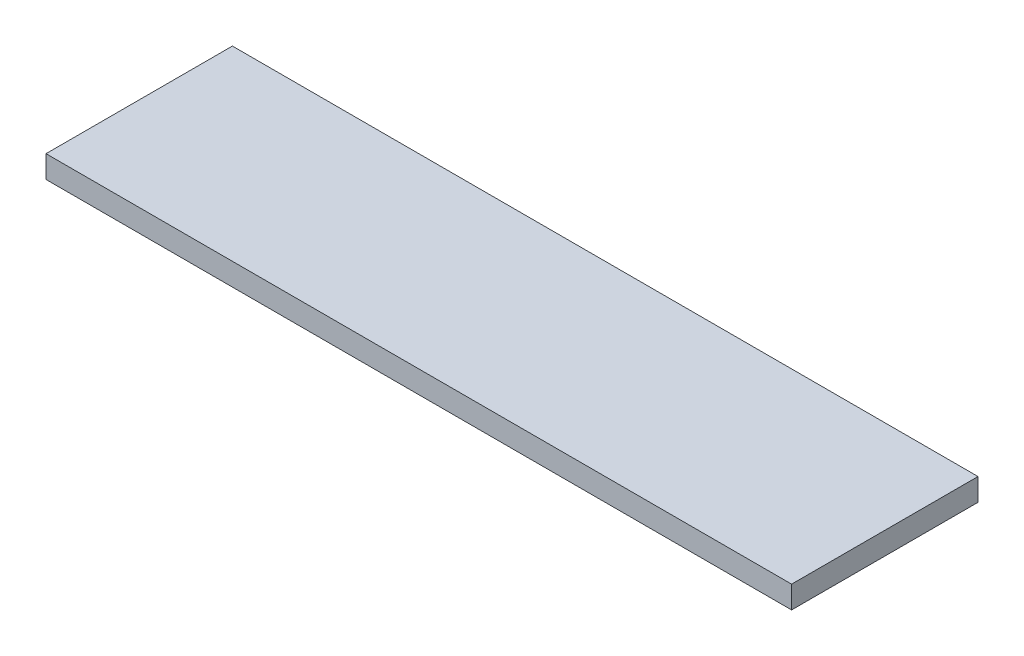
ISO-10303-21;
HEADER;
FILE_DESCRIPTION(('STEP AP214'),'2;1');
FILE_NAME('part.step','',(''),(''),'','','');
FILE_SCHEMA(('AUTOMOTIVE_DESIGN { 1 0 10303 214 1 1 1 1 }'));
ENDSEC;
DATA;
#1=APPLICATION_CONTEXT('core data for automotive mechanical design processes');
#2=APPLICATION_PROTOCOL_DEFINITION('international standard','automotive_design',2000,#1);
#3=PRODUCT_CONTEXT('',#1,'mechanical');
#4=PRODUCT('Part','Part','',(#3));
#5=PRODUCT_RELATED_PRODUCT_CATEGORY('part','',(#4));
#6=PRODUCT_DEFINITION_FORMATION('','',#4);
#7=PRODUCT_DEFINITION_CONTEXT('part definition',#1,'design');
#8=PRODUCT_DEFINITION('design','',#6,#7);
#9=PRODUCT_DEFINITION_SHAPE('','',#8);
#10=(LENGTH_UNIT() NAMED_UNIT(*) SI_UNIT(.MILLI.,.METRE.));
#11=(NAMED_UNIT(*) PLANE_ANGLE_UNIT() SI_UNIT($,.RADIAN.));
#12=(NAMED_UNIT(*) SI_UNIT($,.STERADIAN.) SOLID_ANGLE_UNIT());
#13=UNCERTAINTY_MEASURE_WITH_UNIT(LENGTH_MEASURE(1.E-05),#10,'distance_accuracy_value','');
#14=(GEOMETRIC_REPRESENTATION_CONTEXT(3) GLOBAL_UNCERTAINTY_ASSIGNED_CONTEXT((#13)) GLOBAL_UNIT_ASSIGNED_CONTEXT((#10,
#11,#12)) REPRESENTATION_CONTEXT('',''));
#15=CARTESIAN_POINT('',(0.,0.,0.));
#16=DIRECTION('',(0.,0.,1.));
#17=DIRECTION('',(1.,0.,0.));
#18=AXIS2_PLACEMENT_3D('',#15,#16,#17);
#19=CARTESIAN_POINT('',(-100.,3.,25.));
#20=DIRECTION('',(1.,0.,0.));
#21=DIRECTION('',(0.,0.,-1.));
#22=AXIS2_PLACEMENT_3D('',#19,#20,#21);
#23=PLANE('',#22);
#24=DIRECTION('',(0.,0.,1.));
#25=VECTOR('',#24,1.);
#26=CARTESIAN_POINT('',(-100.,-3.,25.));
#27=LINE('',#26,#25);
#28=CARTESIAN_POINT('',(-100.,-3.,-25.));
#29=VERTEX_POINT('',#28);
#30=CARTESIAN_POINT('',(-100.,-3.,25.));
#31=VERTEX_POINT('',#30);
#32=EDGE_CURVE('E102',#29,#31,#27,.T.);
#33=ORIENTED_EDGE('',*,*,#32,.T.);
#34=DIRECTION('',(0.,-1.,0.));
#35=VECTOR('',#34,1.);
#36=CARTESIAN_POINT('',(-100.,3.,25.));
#37=LINE('',#36,#35);
#38=CARTESIAN_POINT('',(-100.,3.,25.));
#39=VERTEX_POINT('',#38);
#40=EDGE_CURVE('E11',#39,#31,#37,.T.);
#41=ORIENTED_EDGE('',*,*,#40,.F.);
#42=DIRECTION('',(0.,0.,1.));
#43=VECTOR('',#42,1.);
#44=CARTESIAN_POINT('',(-100.,3.,25.));
#45=LINE('',#44,#43);
#46=CARTESIAN_POINT('',(-100.,3.,-25.));
#47=VERTEX_POINT('',#46);
#48=EDGE_CURVE('E90',#47,#39,#45,.T.);
#49=ORIENTED_EDGE('',*,*,#48,.F.);
#50=DIRECTION('',(0.,-1.,0.));
#51=VECTOR('',#50,1.);
#52=CARTESIAN_POINT('',(-100.,3.,-25.));
#53=LINE('',#52,#51);
#54=EDGE_CURVE('E98',#47,#29,#53,.T.);
#55=ORIENTED_EDGE('',*,*,#54,.T.);
#56=EDGE_LOOP('',(#33,#41,#49,#55));
#57=FACE_BOUND('',#56,.T.);
#58=ADVANCED_FACE('F39',(#57),#23,.F.);
#59=CARTESIAN_POINT('',(100.,3.,25.));
#60=DIRECTION('',(0.,0.,-1.));
#61=DIRECTION('',(-1.,0.,0.));
#62=AXIS2_PLACEMENT_3D('',#59,#60,#61);
#63=PLANE('',#62);
#64=DIRECTION('',(1.,0.,0.));
#65=VECTOR('',#64,1.);
#66=CARTESIAN_POINT('',(100.,-3.,25.));
#67=LINE('',#66,#65);
#68=CARTESIAN_POINT('',(100.,-3.,25.));
#69=VERTEX_POINT('',#68);
#70=EDGE_CURVE('E94',#31,#69,#67,.T.);
#71=ORIENTED_EDGE('',*,*,#70,.T.);
#72=DIRECTION('',(0.,-1.,0.));
#73=VECTOR('',#72,1.);
#74=CARTESIAN_POINT('',(100.,3.,25.));
#75=LINE('',#74,#73);
#76=CARTESIAN_POINT('',(100.,3.,25.));
#77=VERTEX_POINT('',#76);
#78=EDGE_CURVE('E47',#77,#69,#75,.T.);
#79=ORIENTED_EDGE('',*,*,#78,.F.);
#80=DIRECTION('',(1.,0.,0.));
#81=VECTOR('',#80,1.);
#82=CARTESIAN_POINT('',(100.,3.,25.));
#83=LINE('',#82,#81);
#84=EDGE_CURVE('E85',#39,#77,#83,.T.);
#85=ORIENTED_EDGE('',*,*,#84,.F.);
#86=ORIENTED_EDGE('',*,*,#40,.T.);
#87=EDGE_LOOP('',(#71,#79,#85,#86));
#88=FACE_BOUND('',#87,.T.);
#89=ADVANCED_FACE('F93',(#88),#63,.F.);
#90=CARTESIAN_POINT('',(100.,3.,-25.));
#91=DIRECTION('',(-1.,0.,0.));
#92=DIRECTION('',(0.,0.,1.));
#93=AXIS2_PLACEMENT_3D('',#90,#91,#92);
#94=PLANE('',#93);
#95=DIRECTION('',(0.,0.,-1.));
#96=VECTOR('',#95,1.);
#97=CARTESIAN_POINT('',(100.,-3.,-25.));
#98=LINE('',#97,#96);
#99=CARTESIAN_POINT('',(100.,-3.,-25.));
#100=VERTEX_POINT('',#99);
#101=EDGE_CURVE('E72',#69,#100,#98,.T.);
#102=ORIENTED_EDGE('',*,*,#101,.T.);
#103=DIRECTION('',(0.,-1.,0.));
#104=VECTOR('',#103,1.);
#105=CARTESIAN_POINT('',(100.,3.,-25.));
#106=LINE('',#105,#104);
#107=CARTESIAN_POINT('',(100.,3.,-25.));
#108=VERTEX_POINT('',#107);
#109=EDGE_CURVE('E95',#108,#100,#106,.T.);
#110=ORIENTED_EDGE('',*,*,#109,.F.);
#111=DIRECTION('',(0.,0.,-1.));
#112=VECTOR('',#111,1.);
#113=CARTESIAN_POINT('',(100.,3.,-25.));
#114=LINE('',#113,#112);
#115=EDGE_CURVE('E88',#77,#108,#114,.T.);
#116=ORIENTED_EDGE('',*,*,#115,.F.);
#117=ORIENTED_EDGE('',*,*,#78,.T.);
#118=EDGE_LOOP('',(#102,#110,#116,#117));
#119=FACE_BOUND('',#118,.T.);
#120=ADVANCED_FACE('F96',(#119),#94,.F.);
#121=CARTESIAN_POINT('',(-100.,3.,-25.));
#122=DIRECTION('',(0.,0.,1.));
#123=DIRECTION('',(1.,0.,0.));
#124=AXIS2_PLACEMENT_3D('',#121,#122,#123);
#125=PLANE('',#124);
#126=DIRECTION('',(-1.,0.,0.));
#127=VECTOR('',#126,1.);
#128=CARTESIAN_POINT('',(-100.,-3.,-25.));
#129=LINE('',#128,#127);
#130=EDGE_CURVE('E78',#100,#29,#129,.T.);
#131=ORIENTED_EDGE('',*,*,#130,.T.);
#132=ORIENTED_EDGE('',*,*,#54,.F.);
#133=DIRECTION('',(-1.,0.,0.));
#134=VECTOR('',#133,1.);
#135=CARTESIAN_POINT('',(-100.,3.,-25.));
#136=LINE('',#135,#134);
#137=EDGE_CURVE('E55',#108,#47,#136,.T.);
#138=ORIENTED_EDGE('',*,*,#137,.F.);
#139=ORIENTED_EDGE('',*,*,#109,.T.);
#140=EDGE_LOOP('',(#131,#132,#138,#139));
#141=FACE_BOUND('',#140,.T.);
#142=ADVANCED_FACE('F109',(#141),#125,.F.);
#143=CARTESIAN_POINT('',(0.,3.,0.));
#144=DIRECTION('',(0.,-1.,0.));
#145=DIRECTION('',(0.,0.,-1.));
#146=AXIS2_PLACEMENT_3D('',#143,#144,#145);
#147=PLANE('',#146);
#148=ORIENTED_EDGE('',*,*,#48,.T.);
#149=ORIENTED_EDGE('',*,*,#84,.T.);
#150=ORIENTED_EDGE('',*,*,#115,.T.);
#151=ORIENTED_EDGE('',*,*,#137,.T.);
#152=EDGE_LOOP('',(#148,#149,#150,#151));
#153=FACE_BOUND('',#152,.T.);
#154=ADVANCED_FACE('F86',(#153),#147,.F.);
#155=CARTESIAN_POINT('',(0.,-3.,0.));
#156=DIRECTION('',(0.,-1.,0.));
#157=DIRECTION('',(0.,0.,-1.));
#158=AXIS2_PLACEMENT_3D('',#155,#156,#157);
#159=PLANE('',#158);
#160=ORIENTED_EDGE('',*,*,#32,.F.);
#161=ORIENTED_EDGE('',*,*,#130,.F.);
#162=ORIENTED_EDGE('',*,*,#101,.F.);
#163=ORIENTED_EDGE('',*,*,#70,.F.);
#164=EDGE_LOOP('',(#160,#161,#162,#163));
#165=FACE_BOUND('',#164,.T.);
#166=ADVANCED_FACE('F112',(#165),#159,.T.);
#167=CLOSED_SHELL('',(#58,#89,#120,#142,#154,#166));
#168=MANIFOLD_SOLID_BREP('B2',#167);
#169=ADVANCED_BREP_SHAPE_REPRESENTATION('',(#18,#168),#14);
#170=SHAPE_DEFINITION_REPRESENTATION(#9,#169);
ENDSEC;
END-ISO-10303-21;
